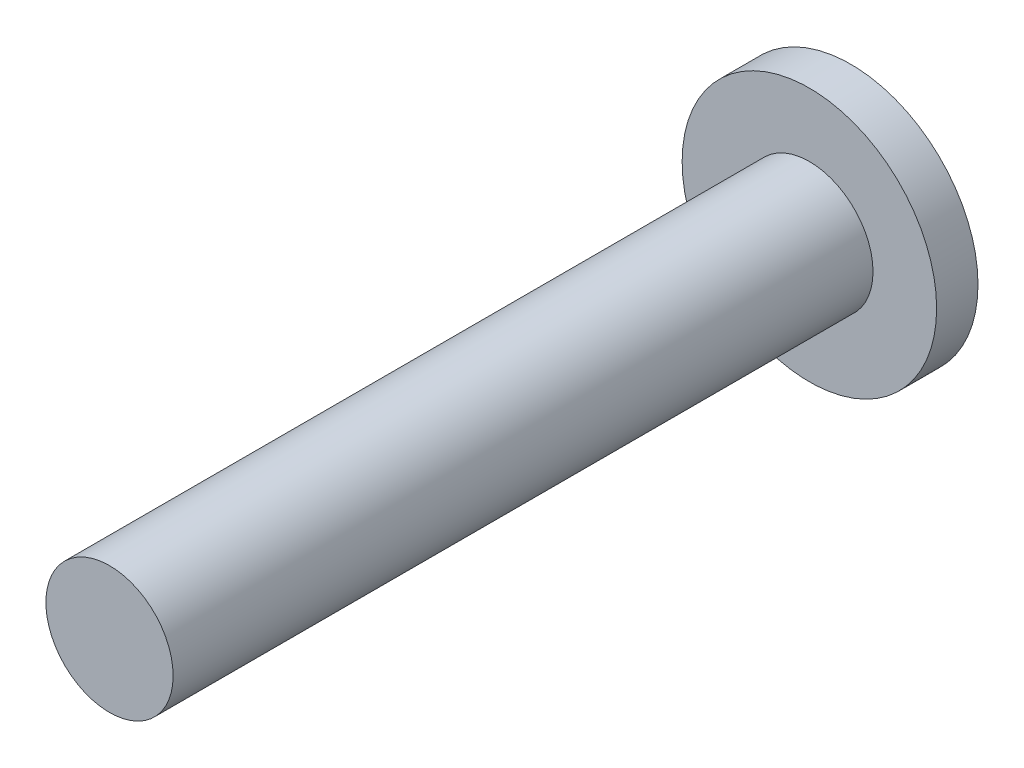
ISO-10303-21;
HEADER;
FILE_DESCRIPTION(('STEP AP214'),'2;1');
FILE_NAME('part.step','',(''),(''),'','','');
FILE_SCHEMA(('AUTOMOTIVE_DESIGN { 1 0 10303 214 1 1 1 1 }'));
ENDSEC;
DATA;
#1=APPLICATION_CONTEXT('core data for automotive mechanical design processes');
#2=APPLICATION_PROTOCOL_DEFINITION('international standard','automotive_design',2000,#1);
#3=PRODUCT_CONTEXT('',#1,'mechanical');
#4=PRODUCT('Part','Part','',(#3));
#5=PRODUCT_RELATED_PRODUCT_CATEGORY('part','',(#4));
#6=PRODUCT_DEFINITION_FORMATION('','',#4);
#7=PRODUCT_DEFINITION_CONTEXT('part definition',#1,'design');
#8=PRODUCT_DEFINITION('design','',#6,#7);
#9=PRODUCT_DEFINITION_SHAPE('','',#8);
#10=(LENGTH_UNIT() NAMED_UNIT(*) SI_UNIT(.MILLI.,.METRE.));
#11=(NAMED_UNIT(*) PLANE_ANGLE_UNIT() SI_UNIT($,.RADIAN.));
#12=(NAMED_UNIT(*) SI_UNIT($,.STERADIAN.) SOLID_ANGLE_UNIT());
#13=UNCERTAINTY_MEASURE_WITH_UNIT(LENGTH_MEASURE(1.E-05),#10,'distance_accuracy_value','');
#14=(GEOMETRIC_REPRESENTATION_CONTEXT(3) GLOBAL_UNCERTAINTY_ASSIGNED_CONTEXT((#13)) GLOBAL_UNIT_ASSIGNED_CONTEXT((#10,
#11,#12)) REPRESENTATION_CONTEXT('',''));
#15=CARTESIAN_POINT('',(0.,0.,0.));
#16=DIRECTION('',(0.,0.,1.));
#17=DIRECTION('',(1.,0.,0.));
#18=AXIS2_PLACEMENT_3D('',#15,#16,#17);
#19=CARTESIAN_POINT('',(0.,0.,1.3));
#20=DIRECTION('',(0.,0.,-1.));
#21=DIRECTION('',(-1.,0.,0.));
#22=AXIS2_PLACEMENT_3D('',#19,#20,#21);
#23=CYLINDRICAL_SURFACE('',#22,4.);
#24=CARTESIAN_POINT('',(0.,0.,1.3));
#25=DIRECTION('',(0.,0.,1.));
#26=DIRECTION('',(1.,0.,0.));
#27=AXIS2_PLACEMENT_3D('',#24,#25,#26);
#28=CIRCLE('',#27,4.);
#29=CARTESIAN_POINT('',(4.,0.,1.3));
#30=VERTEX_POINT('',#29);
#31=EDGE_CURVE('E49',#30,#30,#28,.T.);
#32=ORIENTED_EDGE('',*,*,#31,.F.);
#33=EDGE_LOOP('',(#32));
#34=FACE_BOUND('',#33,.T.);
#35=CARTESIAN_POINT('',(0.,0.,0.));
#36=DIRECTION('',(0.,0.,1.));
#37=DIRECTION('',(1.,0.,0.));
#38=AXIS2_PLACEMENT_3D('',#35,#36,#37);
#39=CIRCLE('',#38,4.);
#40=CARTESIAN_POINT('',(4.,0.,0.));
#41=VERTEX_POINT('',#40);
#42=EDGE_CURVE('E44',#41,#41,#39,.T.);
#43=ORIENTED_EDGE('',*,*,#42,.T.);
#44=EDGE_LOOP('',(#43));
#45=FACE_BOUND('',#44,.T.);
#46=ADVANCED_FACE('F41',(#34,#45),#23,.T.);
#47=CARTESIAN_POINT('',(0.,0.,1.3));
#48=DIRECTION('',(0.,0.,1.));
#49=DIRECTION('',(1.,0.,0.));
#50=AXIS2_PLACEMENT_3D('',#47,#48,#49);
#51=PLANE('',#50);
#52=CARTESIAN_POINT('',(0.,0.,1.3));
#53=DIRECTION('',(0.,0.,1.));
#54=DIRECTION('',(1.,0.,0.));
#55=AXIS2_PLACEMENT_3D('',#52,#53,#54);
#56=CIRCLE('',#55,2.);
#57=CARTESIAN_POINT('',(2.,0.,1.3));
#58=VERTEX_POINT('',#57);
#59=EDGE_CURVE('E11',#58,#58,#56,.T.);
#60=ORIENTED_EDGE('',*,*,#59,.F.);
#61=EDGE_LOOP('',(#60));
#62=FACE_BOUND('',#61,.T.);
#63=ORIENTED_EDGE('',*,*,#31,.T.);
#64=EDGE_LOOP('',(#63));
#65=FACE_BOUND('',#64,.T.);
#66=ADVANCED_FACE('F161',(#62,#65),#51,.T.);
#67=CARTESIAN_POINT('',(0.,0.,0.));
#68=DIRECTION('',(0.,0.,1.));
#69=DIRECTION('',(1.,0.,0.));
#70=AXIS2_PLACEMENT_3D('',#67,#68,#69);
#71=PLANE('',#70);
#72=DIRECTION('',(0.5,0.866025403784439,0.));
#73=VECTOR('',#72,1.);
#74=CARTESIAN_POINT('',(-1.44337567297406,0.,0.));
#75=LINE('',#74,#73);
#76=CARTESIAN_POINT('',(-1.44337567297406,0.,0.));
#77=VERTEX_POINT('',#76);
#78=CARTESIAN_POINT('',(-0.721687836487032,1.25,0.));
#79=VERTEX_POINT('',#78);
#80=EDGE_CURVE('E131',#77,#79,#75,.T.);
#81=ORIENTED_EDGE('',*,*,#80,.F.);
#82=DIRECTION('',(-0.5,0.866025403784439,0.));
#83=VECTOR('',#82,1.);
#84=CARTESIAN_POINT('',(-0.721687836487032,-1.25,0.));
#85=LINE('',#84,#83);
#86=CARTESIAN_POINT('',(-0.721687836487032,-1.25,0.));
#87=VERTEX_POINT('',#86);
#88=EDGE_CURVE('E57',#87,#77,#85,.T.);
#89=ORIENTED_EDGE('',*,*,#88,.F.);
#90=DIRECTION('',(-1.,0.,0.));
#91=VECTOR('',#90,1.);
#92=CARTESIAN_POINT('',(0.721687836487033,-1.25,0.));
#93=LINE('',#92,#91);
#94=CARTESIAN_POINT('',(0.721687836487033,-1.25,0.));
#95=VERTEX_POINT('',#94);
#96=EDGE_CURVE('E140',#95,#87,#93,.T.);
#97=ORIENTED_EDGE('',*,*,#96,.F.);
#98=DIRECTION('',(-0.5,-0.866025403784439,0.));
#99=VECTOR('',#98,1.);
#100=CARTESIAN_POINT('',(1.44337567297406,0.,0.));
#101=LINE('',#100,#99);
#102=CARTESIAN_POINT('',(1.44337567297406,0.,0.));
#103=VERTEX_POINT('',#102);
#104=EDGE_CURVE('E138',#103,#95,#101,.T.);
#105=ORIENTED_EDGE('',*,*,#104,.F.);
#106=DIRECTION('',(0.5,-0.866025403784439,0.));
#107=VECTOR('',#106,1.);
#108=CARTESIAN_POINT('',(0.721687836487033,1.25,0.));
#109=LINE('',#108,#107);
#110=CARTESIAN_POINT('',(0.721687836487033,1.25,0.));
#111=VERTEX_POINT('',#110);
#112=EDGE_CURVE('E105',#111,#103,#109,.T.);
#113=ORIENTED_EDGE('',*,*,#112,.F.);
#114=DIRECTION('',(1.,0.,0.));
#115=VECTOR('',#114,1.);
#116=CARTESIAN_POINT('',(-0.721687836487032,1.25,0.));
#117=LINE('',#116,#115);
#118=EDGE_CURVE('E134',#79,#111,#117,.T.);
#119=ORIENTED_EDGE('',*,*,#118,.F.);
#120=EDGE_LOOP('',(#81,#89,#97,#105,#113,#119));
#121=FACE_BOUND('',#120,.T.);
#122=ORIENTED_EDGE('',*,*,#42,.F.);
#123=EDGE_LOOP('',(#122));
#124=FACE_BOUND('',#123,.T.);
#125=ADVANCED_FACE('F158',(#121,#124),#71,.F.);
#126=CARTESIAN_POINT('',(0.,0.,23.3));
#127=DIRECTION('',(0.,0.,-1.));
#128=DIRECTION('',(-1.,0.,0.));
#129=AXIS2_PLACEMENT_3D('',#126,#127,#128);
#130=CYLINDRICAL_SURFACE('',#129,2.);
#131=CARTESIAN_POINT('',(0.,0.,23.3));
#132=DIRECTION('',(0.,0.,1.));
#133=DIRECTION('',(1.,0.,0.));
#134=AXIS2_PLACEMENT_3D('',#131,#132,#133);
#135=CIRCLE('',#134,2.);
#136=CARTESIAN_POINT('',(2.,0.,23.3));
#137=VERTEX_POINT('',#136);
#138=EDGE_CURVE('E144',#137,#137,#135,.T.);
#139=ORIENTED_EDGE('',*,*,#138,.F.);
#140=EDGE_LOOP('',(#139));
#141=FACE_BOUND('',#140,.T.);
#142=ORIENTED_EDGE('',*,*,#59,.T.);
#143=EDGE_LOOP('',(#142));
#144=FACE_BOUND('',#143,.T.);
#145=ADVANCED_FACE('F160',(#141,#144),#130,.T.);
#146=CARTESIAN_POINT('',(0.,0.,23.3));
#147=DIRECTION('',(0.,0.,1.));
#148=DIRECTION('',(1.,0.,0.));
#149=AXIS2_PLACEMENT_3D('',#146,#147,#148);
#150=PLANE('',#149);
#151=ORIENTED_EDGE('',*,*,#138,.T.);
#152=EDGE_LOOP('',(#151));
#153=FACE_BOUND('',#152,.T.);
#154=ADVANCED_FACE('F168',(#153),#150,.T.);
#155=CARTESIAN_POINT('',(-0.721687836487032,-1.25,1.));
#156=DIRECTION('',(-0.866025403784439,-0.5,0.));
#157=DIRECTION('',(0.5,-0.866025403784439,0.));
#158=AXIS2_PLACEMENT_3D('',#155,#156,#157);
#159=PLANE('',#158);
#160=ORIENTED_EDGE('',*,*,#88,.T.);
#161=DIRECTION('',(0.,0.,-1.));
#162=VECTOR('',#161,1.);
#163=CARTESIAN_POINT('',(-1.44337567297406,0.,1.));
#164=LINE('',#163,#162);
#165=CARTESIAN_POINT('',(-1.44337567297406,0.,1.));
#166=VERTEX_POINT('',#165);
#167=EDGE_CURVE('E87',#166,#77,#164,.T.);
#168=ORIENTED_EDGE('',*,*,#167,.F.);
#169=DIRECTION('',(-0.5,0.866025403784439,0.));
#170=VECTOR('',#169,1.);
#171=CARTESIAN_POINT('',(-0.721687836487032,-1.25,1.));
#172=LINE('',#171,#170);
#173=CARTESIAN_POINT('',(-0.721687836487032,-1.25,1.));
#174=VERTEX_POINT('',#173);
#175=EDGE_CURVE('E142',#174,#166,#172,.T.);
#176=ORIENTED_EDGE('',*,*,#175,.F.);
#177=DIRECTION('',(0.,0.,-1.));
#178=VECTOR('',#177,1.);
#179=CARTESIAN_POINT('',(-0.721687836487032,-1.25,1.));
#180=LINE('',#179,#178);
#181=EDGE_CURVE('E65',#174,#87,#180,.T.);
#182=ORIENTED_EDGE('',*,*,#181,.T.);
#183=EDGE_LOOP('',(#160,#168,#176,#182));
#184=FACE_BOUND('',#183,.T.);
#185=ADVANCED_FACE('F194',(#184),#159,.F.);
#186=CARTESIAN_POINT('',(0.721687836487033,-1.25,1.));
#187=DIRECTION('',(0.,-1.,0.));
#188=DIRECTION('',(0.,0.,-1.));
#189=AXIS2_PLACEMENT_3D('',#186,#187,#188);
#190=PLANE('',#189);
#191=ORIENTED_EDGE('',*,*,#96,.T.);
#192=ORIENTED_EDGE('',*,*,#181,.F.);
#193=DIRECTION('',(-1.,0.,0.));
#194=VECTOR('',#193,1.);
#195=CARTESIAN_POINT('',(0.721687836487033,-1.25,1.));
#196=LINE('',#195,#194);
#197=CARTESIAN_POINT('',(0.721687836487033,-1.25,1.));
#198=VERTEX_POINT('',#197);
#199=EDGE_CURVE('E117',#198,#174,#196,.T.);
#200=ORIENTED_EDGE('',*,*,#199,.F.);
#201=DIRECTION('',(0.,0.,-1.));
#202=VECTOR('',#201,1.);
#203=CARTESIAN_POINT('',(0.721687836487033,-1.25,1.));
#204=LINE('',#203,#202);
#205=EDGE_CURVE('E109',#198,#95,#204,.T.);
#206=ORIENTED_EDGE('',*,*,#205,.T.);
#207=EDGE_LOOP('',(#191,#192,#200,#206));
#208=FACE_BOUND('',#207,.T.);
#209=ADVANCED_FACE('F206',(#208),#190,.F.);
#210=CARTESIAN_POINT('',(1.44337567297406,0.,1.));
#211=DIRECTION('',(0.866025403784439,-0.5,0.));
#212=DIRECTION('',(0.5,0.866025403784439,0.));
#213=AXIS2_PLACEMENT_3D('',#210,#211,#212);
#214=PLANE('',#213);
#215=ORIENTED_EDGE('',*,*,#104,.T.);
#216=ORIENTED_EDGE('',*,*,#205,.F.);
#217=DIRECTION('',(-0.5,-0.866025403784439,0.));
#218=VECTOR('',#217,1.);
#219=CARTESIAN_POINT('',(1.44337567297406,0.,1.));
#220=LINE('',#219,#218);
#221=CARTESIAN_POINT('',(1.44337567297406,0.,1.));
#222=VERTEX_POINT('',#221);
#223=EDGE_CURVE('E113',#222,#198,#220,.T.);
#224=ORIENTED_EDGE('',*,*,#223,.F.);
#225=DIRECTION('',(0.,0.,-1.));
#226=VECTOR('',#225,1.);
#227=CARTESIAN_POINT('',(1.44337567297406,0.,1.));
#228=LINE('',#227,#226);
#229=EDGE_CURVE('E98',#222,#103,#228,.T.);
#230=ORIENTED_EDGE('',*,*,#229,.T.);
#231=EDGE_LOOP('',(#215,#216,#224,#230));
#232=FACE_BOUND('',#231,.T.);
#233=ADVANCED_FACE('F114',(#232),#214,.F.);
#234=CARTESIAN_POINT('',(0.721687836487033,1.25,1.));
#235=DIRECTION('',(0.866025403784439,0.5,0.));
#236=DIRECTION('',(-0.5,0.866025403784439,0.));
#237=AXIS2_PLACEMENT_3D('',#234,#235,#236);
#238=PLANE('',#237);
#239=ORIENTED_EDGE('',*,*,#112,.T.);
#240=ORIENTED_EDGE('',*,*,#229,.F.);
#241=DIRECTION('',(0.5,-0.866025403784439,0.));
#242=VECTOR('',#241,1.);
#243=CARTESIAN_POINT('',(0.721687836487033,1.25,1.));
#244=LINE('',#243,#242);
#245=CARTESIAN_POINT('',(0.721687836487033,1.25,1.));
#246=VERTEX_POINT('',#245);
#247=EDGE_CURVE('E102',#246,#222,#244,.T.);
#248=ORIENTED_EDGE('',*,*,#247,.F.);
#249=DIRECTION('',(0.,0.,-1.));
#250=VECTOR('',#249,1.);
#251=CARTESIAN_POINT('',(0.721687836487033,1.25,1.));
#252=LINE('',#251,#250);
#253=EDGE_CURVE('E110',#246,#111,#252,.T.);
#254=ORIENTED_EDGE('',*,*,#253,.T.);
#255=EDGE_LOOP('',(#239,#240,#248,#254));
#256=FACE_BOUND('',#255,.T.);
#257=ADVANCED_FACE('F100',(#256),#238,.F.);
#258=CARTESIAN_POINT('',(-0.721687836487032,1.25,1.));
#259=DIRECTION('',(0.,1.,0.));
#260=DIRECTION('',(0.,0.,1.));
#261=AXIS2_PLACEMENT_3D('',#258,#259,#260);
#262=PLANE('',#261);
#263=ORIENTED_EDGE('',*,*,#118,.T.);
#264=ORIENTED_EDGE('',*,*,#253,.F.);
#265=DIRECTION('',(1.,0.,0.));
#266=VECTOR('',#265,1.);
#267=CARTESIAN_POINT('',(-0.721687836487032,1.25,1.));
#268=LINE('',#267,#266);
#269=CARTESIAN_POINT('',(-0.721687836487032,1.25,1.));
#270=VERTEX_POINT('',#269);
#271=EDGE_CURVE('E123',#270,#246,#268,.T.);
#272=ORIENTED_EDGE('',*,*,#271,.F.);
#273=DIRECTION('',(0.,0.,-1.));
#274=VECTOR('',#273,1.);
#275=CARTESIAN_POINT('',(-0.721687836487032,1.25,1.));
#276=LINE('',#275,#274);
#277=EDGE_CURVE('E147',#270,#79,#276,.T.);
#278=ORIENTED_EDGE('',*,*,#277,.T.);
#279=EDGE_LOOP('',(#263,#264,#272,#278));
#280=FACE_BOUND('',#279,.T.);
#281=ADVANCED_FACE('F231',(#280),#262,.F.);
#282=CARTESIAN_POINT('',(-1.44337567297406,0.,1.));
#283=DIRECTION('',(-0.866025403784439,0.5,0.));
#284=DIRECTION('',(-0.5,-0.866025403784439,0.));
#285=AXIS2_PLACEMENT_3D('',#282,#283,#284);
#286=PLANE('',#285);
#287=ORIENTED_EDGE('',*,*,#80,.T.);
#288=ORIENTED_EDGE('',*,*,#277,.F.);
#289=DIRECTION('',(0.5,0.866025403784439,0.));
#290=VECTOR('',#289,1.);
#291=CARTESIAN_POINT('',(-1.44337567297406,0.,1.));
#292=LINE('',#291,#290);
#293=EDGE_CURVE('E125',#166,#270,#292,.T.);
#294=ORIENTED_EDGE('',*,*,#293,.F.);
#295=ORIENTED_EDGE('',*,*,#167,.T.);
#296=EDGE_LOOP('',(#287,#288,#294,#295));
#297=FACE_BOUND('',#296,.T.);
#298=ADVANCED_FACE('F240',(#297),#286,.F.);
#299=CARTESIAN_POINT('',(0.,0.,1.));
#300=DIRECTION('',(0.,0.,-1.));
#301=DIRECTION('',(-1.,0.,0.));
#302=AXIS2_PLACEMENT_3D('',#299,#300,#301);
#303=PLANE('',#302);
#304=ORIENTED_EDGE('',*,*,#175,.T.);
#305=ORIENTED_EDGE('',*,*,#293,.T.);
#306=ORIENTED_EDGE('',*,*,#271,.T.);
#307=ORIENTED_EDGE('',*,*,#247,.T.);
#308=ORIENTED_EDGE('',*,*,#223,.T.);
#309=ORIENTED_EDGE('',*,*,#199,.T.);
#310=EDGE_LOOP('',(#304,#305,#306,#307,#308,#309));
#311=FACE_BOUND('',#310,.T.);
#312=ADVANCED_FACE('F120',(#311),#303,.T.);
#313=CLOSED_SHELL('',(#46,#66,#125,#145,#154,#185,#209,#233,#257,#281,#298,#312));
#314=MANIFOLD_SOLID_BREP('B2',#313);
#315=ADVANCED_BREP_SHAPE_REPRESENTATION('',(#18,#314),#14);
#316=SHAPE_DEFINITION_REPRESENTATION(#9,#315);
ENDSEC;
END-ISO-10303-21;
